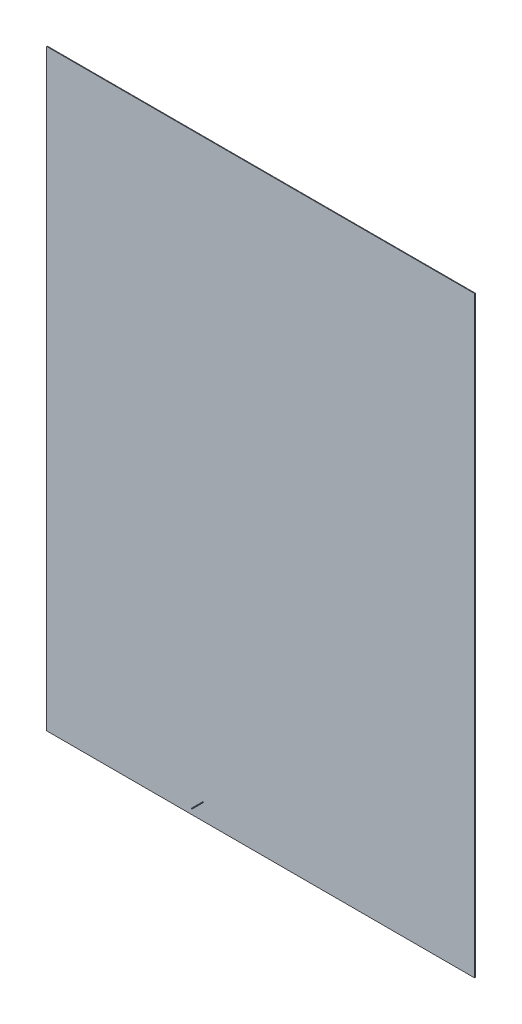
ISO-10303-21;
HEADER;
FILE_DESCRIPTION(('STEP AP214'),'2;1');
FILE_NAME('part.step','',(''),(''),'','','');
FILE_SCHEMA(('AUTOMOTIVE_DESIGN { 1 0 10303 214 1 1 1 1 }'));
ENDSEC;
DATA;
#1=APPLICATION_CONTEXT('core data for automotive mechanical design processes');
#2=APPLICATION_PROTOCOL_DEFINITION('international standard','automotive_design',2000,#1);
#3=PRODUCT_CONTEXT('',#1,'mechanical');
#4=PRODUCT('Part','Part','',(#3));
#5=PRODUCT_RELATED_PRODUCT_CATEGORY('part','',(#4));
#6=PRODUCT_DEFINITION_FORMATION('','',#4);
#7=PRODUCT_DEFINITION_CONTEXT('part definition',#1,'design');
#8=PRODUCT_DEFINITION('design','',#6,#7);
#9=PRODUCT_DEFINITION_SHAPE('','',#8);
#10=(LENGTH_UNIT() NAMED_UNIT(*) SI_UNIT(.MILLI.,.METRE.));
#11=(NAMED_UNIT(*) PLANE_ANGLE_UNIT() SI_UNIT($,.RADIAN.));
#12=(NAMED_UNIT(*) SI_UNIT($,.STERADIAN.) SOLID_ANGLE_UNIT());
#13=UNCERTAINTY_MEASURE_WITH_UNIT(LENGTH_MEASURE(1.E-05),#10,'distance_accuracy_value','');
#14=(GEOMETRIC_REPRESENTATION_CONTEXT(3) GLOBAL_UNCERTAINTY_ASSIGNED_CONTEXT((#13)) GLOBAL_UNIT_ASSIGNED_CONTEXT((#10,
#11,#12)) REPRESENTATION_CONTEXT('',''));
#15=CARTESIAN_POINT('',(0.,0.,0.));
#16=DIRECTION('',(0.,0.,1.));
#17=DIRECTION('',(1.,0.,0.));
#18=AXIS2_PLACEMENT_3D('',#15,#16,#17);
#19=CARTESIAN_POINT('',(224.25,-850.75,34.));
#20=DIRECTION('',(0.,0.,1.));
#21=DIRECTION('',(1.,0.,0.));
#22=AXIS2_PLACEMENT_3D('',#19,#20,#21);
#23=PLANE('',#22);
#24=DIRECTION('',(0.,1.,0.));
#25=VECTOR('',#24,1.);
#26=CARTESIAN_POINT('',(224.25,-850.75,34.));
#27=LINE('',#26,#25);
#28=CARTESIAN_POINT('',(224.25,-850.75,34.));
#29=VERTEX_POINT('',#28);
#30=CARTESIAN_POINT('',(224.25,-849.25,34.));
#31=VERTEX_POINT('',#30);
#32=EDGE_CURVE('E134',#29,#31,#27,.T.);
#33=ORIENTED_EDGE('',*,*,#32,.F.);
#34=DIRECTION('',(1.,0.,0.));
#35=VECTOR('',#34,1.);
#36=CARTESIAN_POINT('',(224.25,-850.75,34.));
#37=LINE('',#36,#35);
#38=CARTESIAN_POINT('',(225.75,-850.75,34.));
#39=VERTEX_POINT('',#38);
#40=EDGE_CURVE('E140',#29,#39,#37,.T.);
#41=ORIENTED_EDGE('',*,*,#40,.T.);
#42=DIRECTION('',(0.,1.,0.));
#43=VECTOR('',#42,1.);
#44=CARTESIAN_POINT('',(225.75,-850.75,34.));
#45=LINE('',#44,#43);
#46=CARTESIAN_POINT('',(225.75,-849.25,34.));
#47=VERTEX_POINT('',#46);
#48=EDGE_CURVE('E26',#39,#47,#45,.T.);
#49=ORIENTED_EDGE('',*,*,#48,.T.);
#50=DIRECTION('',(1.,0.,0.));
#51=VECTOR('',#50,1.);
#52=CARTESIAN_POINT('',(224.25,-849.25,34.));
#53=LINE('',#52,#51);
#54=EDGE_CURVE('E10',#31,#47,#53,.T.);
#55=ORIENTED_EDGE('',*,*,#54,.F.);
#56=EDGE_LOOP('',(#33,#41,#49,#55));
#57=FACE_BOUND('',#56,.T.);
#58=ADVANCED_FACE('F15',(#57),#23,.T.);
#59=CARTESIAN_POINT('',(224.25,-849.25,0.));
#60=DIRECTION('',(0.,1.,0.));
#61=DIRECTION('',(1.,0.,0.));
#62=AXIS2_PLACEMENT_3D('',#59,#60,#61);
#63=PLANE('',#62);
#64=DIRECTION('',(1.,0.,0.));
#65=VECTOR('',#64,1.);
#66=CARTESIAN_POINT('',(224.25,-849.25,0.));
#67=LINE('',#66,#65);
#68=CARTESIAN_POINT('',(224.25,-849.25,0.));
#69=VERTEX_POINT('',#68);
#70=CARTESIAN_POINT('',(225.75,-849.25,0.));
#71=VERTEX_POINT('',#70);
#72=EDGE_CURVE('E152',#69,#71,#67,.T.);
#73=ORIENTED_EDGE('',*,*,#72,.F.);
#74=DIRECTION('',(0.,0.,1.));
#75=VECTOR('',#74,1.);
#76=CARTESIAN_POINT('',(224.25,-849.25,0.));
#77=LINE('',#76,#75);
#78=EDGE_CURVE('E131',#69,#31,#77,.T.);
#79=ORIENTED_EDGE('',*,*,#78,.T.);
#80=ORIENTED_EDGE('',*,*,#54,.T.);
#81=DIRECTION('',(0.,0.,1.));
#82=VECTOR('',#81,1.);
#83=CARTESIAN_POINT('',(225.75,-849.25,0.));
#84=LINE('',#83,#82);
#85=EDGE_CURVE('E144',#71,#47,#84,.T.);
#86=ORIENTED_EDGE('',*,*,#85,.F.);
#87=EDGE_LOOP('',(#73,#79,#80,#86));
#88=FACE_BOUND('',#87,.T.);
#89=ADVANCED_FACE('F172',(#88),#63,.T.);
#90=CARTESIAN_POINT('',(225.75,-850.75,0.));
#91=DIRECTION('',(1.,0.,0.));
#92=DIRECTION('',(0.,1.,0.));
#93=AXIS2_PLACEMENT_3D('',#90,#91,#92);
#94=PLANE('',#93);
#95=DIRECTION('',(0.,0.,1.));
#96=VECTOR('',#95,1.);
#97=CARTESIAN_POINT('',(225.75,-850.75,0.));
#98=LINE('',#97,#96);
#99=CARTESIAN_POINT('',(225.75,-850.75,0.));
#100=VERTEX_POINT('',#99);
#101=EDGE_CURVE('E136',#100,#39,#98,.T.);
#102=ORIENTED_EDGE('',*,*,#101,.F.);
#103=DIRECTION('',(0.,1.,0.));
#104=VECTOR('',#103,1.);
#105=CARTESIAN_POINT('',(225.75,-850.75,0.));
#106=LINE('',#105,#104);
#107=EDGE_CURVE('E124',#100,#71,#106,.T.);
#108=ORIENTED_EDGE('',*,*,#107,.T.);
#109=ORIENTED_EDGE('',*,*,#85,.T.);
#110=ORIENTED_EDGE('',*,*,#48,.F.);
#111=EDGE_LOOP('',(#102,#108,#109,#110));
#112=FACE_BOUND('',#111,.T.);
#113=ADVANCED_FACE('F168',(#112),#94,.T.);
#114=CARTESIAN_POINT('',(224.25,-850.75,0.));
#115=DIRECTION('',(0.,1.,0.));
#116=DIRECTION('',(1.,0.,0.));
#117=AXIS2_PLACEMENT_3D('',#114,#115,#116);
#118=PLANE('',#117);
#119=ORIENTED_EDGE('',*,*,#101,.T.);
#120=ORIENTED_EDGE('',*,*,#40,.F.);
#121=DIRECTION('',(0.,0.,1.));
#122=VECTOR('',#121,1.);
#123=CARTESIAN_POINT('',(224.25,-850.75,0.));
#124=LINE('',#123,#122);
#125=CARTESIAN_POINT('',(224.25,-850.75,0.));
#126=VERTEX_POINT('',#125);
#127=EDGE_CURVE('E133',#126,#29,#124,.T.);
#128=ORIENTED_EDGE('',*,*,#127,.F.);
#129=DIRECTION('',(1.,0.,0.));
#130=VECTOR('',#129,1.);
#131=CARTESIAN_POINT('',(224.25,-850.75,0.));
#132=LINE('',#131,#130);
#133=EDGE_CURVE('E126',#126,#100,#132,.T.);
#134=ORIENTED_EDGE('',*,*,#133,.T.);
#135=EDGE_LOOP('',(#119,#120,#128,#134));
#136=FACE_BOUND('',#135,.T.);
#137=ADVANCED_FACE('F17',(#136),#118,.F.);
#138=CARTESIAN_POINT('',(224.25,-850.75,0.));
#139=DIRECTION('',(1.,0.,0.));
#140=DIRECTION('',(0.,1.,0.));
#141=AXIS2_PLACEMENT_3D('',#138,#139,#140);
#142=PLANE('',#141);
#143=ORIENTED_EDGE('',*,*,#32,.T.);
#144=ORIENTED_EDGE('',*,*,#78,.F.);
#145=DIRECTION('',(0.,1.,0.));
#146=VECTOR('',#145,1.);
#147=CARTESIAN_POINT('',(224.25,-850.75,0.));
#148=LINE('',#147,#146);
#149=EDGE_CURVE('E148',#126,#69,#148,.T.);
#150=ORIENTED_EDGE('',*,*,#149,.F.);
#151=ORIENTED_EDGE('',*,*,#127,.T.);
#152=EDGE_LOOP('',(#143,#144,#150,#151));
#153=FACE_BOUND('',#152,.T.);
#154=ADVANCED_FACE('F185',(#153),#142,.F.);
#155=CARTESIAN_POINT('',(1050.,-900.,-2.));
#156=DIRECTION('',(1.,0.,0.));
#157=DIRECTION('',(0.,1.,0.));
#158=AXIS2_PLACEMENT_3D('',#155,#156,#157);
#159=PLANE('',#158);
#160=DIRECTION('',(0.,0.,1.));
#161=VECTOR('',#160,1.);
#162=CARTESIAN_POINT('',(1050.,-900.,-2.));
#163=LINE('',#162,#161);
#164=CARTESIAN_POINT('',(1050.,-900.,-2.));
#165=VERTEX_POINT('',#164);
#166=CARTESIAN_POINT('',(1050.,-900.,0.));
#167=VERTEX_POINT('',#166);
#168=EDGE_CURVE('E110',#165,#167,#163,.T.);
#169=ORIENTED_EDGE('',*,*,#168,.F.);
#170=DIRECTION('',(0.,1.,0.));
#171=VECTOR('',#170,1.);
#172=CARTESIAN_POINT('',(1050.,-900.,-2.));
#173=LINE('',#172,#171);
#174=CARTESIAN_POINT('',(1050.,900.,-2.));
#175=VERTEX_POINT('',#174);
#176=EDGE_CURVE('E95',#165,#175,#173,.T.);
#177=ORIENTED_EDGE('',*,*,#176,.T.);
#178=DIRECTION('',(0.,0.,1.));
#179=VECTOR('',#178,1.);
#180=CARTESIAN_POINT('',(1050.,900.,-2.));
#181=LINE('',#180,#179);
#182=CARTESIAN_POINT('',(1050.,900.,0.));
#183=VERTEX_POINT('',#182);
#184=EDGE_CURVE('E147',#175,#183,#181,.T.);
#185=ORIENTED_EDGE('',*,*,#184,.T.);
#186=DIRECTION('',(0.,1.,0.));
#187=VECTOR('',#186,1.);
#188=CARTESIAN_POINT('',(1050.,-900.,0.));
#189=LINE('',#188,#187);
#190=EDGE_CURVE('E100',#167,#183,#189,.T.);
#191=ORIENTED_EDGE('',*,*,#190,.F.);
#192=EDGE_LOOP('',(#169,#177,#185,#191));
#193=FACE_BOUND('',#192,.T.);
#194=ADVANCED_FACE('F214',(#193),#159,.T.);
#195=CARTESIAN_POINT('',(-250.,-900.,-2.));
#196=DIRECTION('',(0.,0.,1.));
#197=DIRECTION('',(1.,0.,0.));
#198=AXIS2_PLACEMENT_3D('',#195,#196,#197);
#199=PLANE('',#198);
#200=DIRECTION('',(1.,0.,0.));
#201=VECTOR('',#200,1.);
#202=CARTESIAN_POINT('',(-250.,900.,-2.));
#203=LINE('',#202,#201);
#204=CARTESIAN_POINT('',(-250.,900.,-2.));
#205=VERTEX_POINT('',#204);
#206=EDGE_CURVE('E130',#205,#175,#203,.T.);
#207=ORIENTED_EDGE('',*,*,#206,.T.);
#208=ORIENTED_EDGE('',*,*,#176,.F.);
#209=DIRECTION('',(1.,0.,0.));
#210=VECTOR('',#209,1.);
#211=CARTESIAN_POINT('',(-250.,-900.,-2.));
#212=LINE('',#211,#210);
#213=CARTESIAN_POINT('',(-250.,-900.,-2.));
#214=VERTEX_POINT('',#213);
#215=EDGE_CURVE('E88',#214,#165,#212,.T.);
#216=ORIENTED_EDGE('',*,*,#215,.F.);
#217=DIRECTION('',(0.,1.,0.));
#218=VECTOR('',#217,1.);
#219=CARTESIAN_POINT('',(-250.,-900.,-2.));
#220=LINE('',#219,#218);
#221=EDGE_CURVE('E93',#214,#205,#220,.T.);
#222=ORIENTED_EDGE('',*,*,#221,.T.);
#223=EDGE_LOOP('',(#207,#208,#216,#222));
#224=FACE_BOUND('',#223,.T.);
#225=ADVANCED_FACE('F91',(#224),#199,.F.);
#226=CARTESIAN_POINT('',(-250.,900.,-2.));
#227=DIRECTION('',(0.,1.,0.));
#228=DIRECTION('',(1.,0.,0.));
#229=AXIS2_PLACEMENT_3D('',#226,#227,#228);
#230=PLANE('',#229);
#231=ORIENTED_EDGE('',*,*,#206,.F.);
#232=DIRECTION('',(0.,0.,1.));
#233=VECTOR('',#232,1.);
#234=CARTESIAN_POINT('',(-250.,900.,-2.));
#235=LINE('',#234,#233);
#236=CARTESIAN_POINT('',(-250.,900.,0.));
#237=VERTEX_POINT('',#236);
#238=EDGE_CURVE('E113',#205,#237,#235,.T.);
#239=ORIENTED_EDGE('',*,*,#238,.T.);
#240=DIRECTION('',(1.,0.,0.));
#241=VECTOR('',#240,1.);
#242=CARTESIAN_POINT('',(-250.,900.,0.));
#243=LINE('',#242,#241);
#244=EDGE_CURVE('E153',#237,#183,#243,.T.);
#245=ORIENTED_EDGE('',*,*,#244,.T.);
#246=ORIENTED_EDGE('',*,*,#184,.F.);
#247=EDGE_LOOP('',(#231,#239,#245,#246));
#248=FACE_BOUND('',#247,.T.);
#249=ADVANCED_FACE('F217',(#248),#230,.T.);
#250=CARTESIAN_POINT('',(-250.,-900.,0.));
#251=DIRECTION('',(0.,0.,1.));
#252=DIRECTION('',(1.,0.,0.));
#253=AXIS2_PLACEMENT_3D('',#250,#251,#252);
#254=PLANE('',#253);
#255=ORIENTED_EDGE('',*,*,#149,.T.);
#256=ORIENTED_EDGE('',*,*,#72,.T.);
#257=ORIENTED_EDGE('',*,*,#107,.F.);
#258=ORIENTED_EDGE('',*,*,#133,.F.);
#259=EDGE_LOOP('',(#255,#256,#257,#258));
#260=FACE_BOUND('',#259,.T.);
#261=DIRECTION('',(0.,1.,0.));
#262=VECTOR('',#261,1.);
#263=CARTESIAN_POINT('',(-250.,-900.,0.));
#264=LINE('',#263,#262);
#265=CARTESIAN_POINT('',(-250.,-900.,0.));
#266=VERTEX_POINT('',#265);
#267=EDGE_CURVE('E120',#266,#237,#264,.T.);
#268=ORIENTED_EDGE('',*,*,#267,.F.);
#269=DIRECTION('',(1.,0.,0.));
#270=VECTOR('',#269,1.);
#271=CARTESIAN_POINT('',(-250.,-900.,0.));
#272=LINE('',#271,#270);
#273=EDGE_CURVE('E101',#266,#167,#272,.T.);
#274=ORIENTED_EDGE('',*,*,#273,.T.);
#275=ORIENTED_EDGE('',*,*,#190,.T.);
#276=ORIENTED_EDGE('',*,*,#244,.F.);
#277=EDGE_LOOP('',(#268,#274,#275,#276));
#278=FACE_BOUND('',#277,.T.);
#279=ADVANCED_FACE('F181',(#260,#278),#254,.T.);
#280=CARTESIAN_POINT('',(-250.,-900.,-2.));
#281=DIRECTION('',(0.,1.,0.));
#282=DIRECTION('',(1.,0.,0.));
#283=AXIS2_PLACEMENT_3D('',#280,#281,#282);
#284=PLANE('',#283);
#285=ORIENTED_EDGE('',*,*,#168,.T.);
#286=ORIENTED_EDGE('',*,*,#273,.F.);
#287=DIRECTION('',(0.,0.,1.));
#288=VECTOR('',#287,1.);
#289=CARTESIAN_POINT('',(-250.,-900.,-2.));
#290=LINE('',#289,#288);
#291=EDGE_CURVE('E19',#214,#266,#290,.T.);
#292=ORIENTED_EDGE('',*,*,#291,.F.);
#293=ORIENTED_EDGE('',*,*,#215,.T.);
#294=EDGE_LOOP('',(#285,#286,#292,#293));
#295=FACE_BOUND('',#294,.T.);
#296=ADVANCED_FACE('F104',(#295),#284,.F.);
#297=CARTESIAN_POINT('',(-250.,-900.,-2.));
#298=DIRECTION('',(1.,0.,0.));
#299=DIRECTION('',(0.,1.,0.));
#300=AXIS2_PLACEMENT_3D('',#297,#298,#299);
#301=PLANE('',#300);
#302=ORIENTED_EDGE('',*,*,#267,.T.);
#303=ORIENTED_EDGE('',*,*,#238,.F.);
#304=ORIENTED_EDGE('',*,*,#221,.F.);
#305=ORIENTED_EDGE('',*,*,#291,.T.);
#306=EDGE_LOOP('',(#302,#303,#304,#305));
#307=FACE_BOUND('',#306,.T.);
#308=ADVANCED_FACE('F111',(#307),#301,.F.);
#309=CLOSED_SHELL('',(#58,#89,#113,#137,#154,#194,#225,#249,#279,#296,#308));
#310=MANIFOLD_SOLID_BREP('B1',#309);
#311=ADVANCED_BREP_SHAPE_REPRESENTATION('',(#18,#310),#14);
#312=SHAPE_DEFINITION_REPRESENTATION(#9,#311);
ENDSEC;
END-ISO-10303-21;
